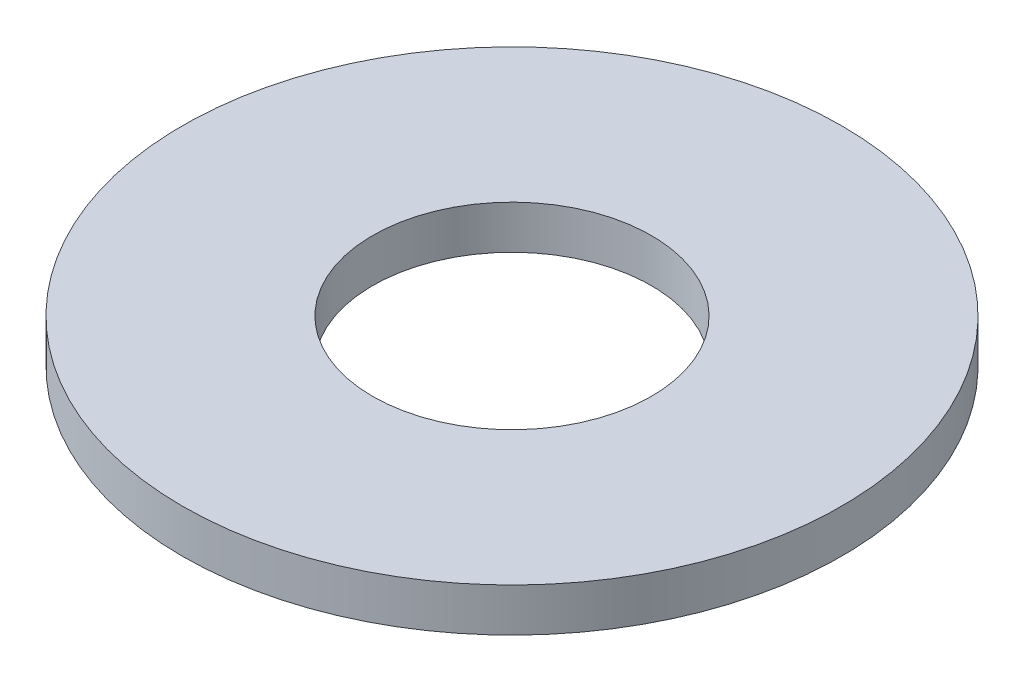
ISO-10303-21;
HEADER;
FILE_DESCRIPTION(('STEP AP214'),'2;1');
FILE_NAME('part.step','',(''),(''),'','','');
FILE_SCHEMA(('AUTOMOTIVE_DESIGN { 1 0 10303 214 1 1 1 1 }'));
ENDSEC;
DATA;
#1=APPLICATION_CONTEXT('core data for automotive mechanical design processes');
#2=APPLICATION_PROTOCOL_DEFINITION('international standard','automotive_design',2000,#1);
#3=PRODUCT_CONTEXT('',#1,'mechanical');
#4=PRODUCT('Part','Part','',(#3));
#5=PRODUCT_RELATED_PRODUCT_CATEGORY('part','',(#4));
#6=PRODUCT_DEFINITION_FORMATION('','',#4);
#7=PRODUCT_DEFINITION_CONTEXT('part definition',#1,'design');
#8=PRODUCT_DEFINITION('design','',#6,#7);
#9=PRODUCT_DEFINITION_SHAPE('','',#8);
#10=(LENGTH_UNIT() NAMED_UNIT(*) SI_UNIT(.MILLI.,.METRE.));
#11=(NAMED_UNIT(*) PLANE_ANGLE_UNIT() SI_UNIT($,.RADIAN.));
#12=(NAMED_UNIT(*) SI_UNIT($,.STERADIAN.) SOLID_ANGLE_UNIT());
#13=UNCERTAINTY_MEASURE_WITH_UNIT(LENGTH_MEASURE(1.E-05),#10,'distance_accuracy_value','');
#14=(GEOMETRIC_REPRESENTATION_CONTEXT(3) GLOBAL_UNCERTAINTY_ASSIGNED_CONTEXT((#13)) GLOBAL_UNIT_ASSIGNED_CONTEXT((#10,
#11,#12)) REPRESENTATION_CONTEXT('',''));
#15=CARTESIAN_POINT('',(0.,0.,0.));
#16=DIRECTION('',(0.,0.,1.));
#17=DIRECTION('',(1.,0.,0.));
#18=AXIS2_PLACEMENT_3D('',#15,#16,#17);
#19=CARTESIAN_POINT('',(0.,5.,0.));
#20=DIRECTION('',(0.,1.,0.));
#21=DIRECTION('',(0.,0.,1.));
#22=AXIS2_PLACEMENT_3D('',#19,#20,#21);
#23=PLANE('',#22);
#24=CARTESIAN_POINT('',(0.,5.,0.));
#25=DIRECTION('',(0.,1.,0.));
#26=DIRECTION('',(0.,0.,1.));
#27=AXIS2_PLACEMENT_3D('',#24,#25,#26);
#28=CIRCLE('',#27,37.95);
#29=CARTESIAN_POINT('',(0.,5.,37.95));
#30=VERTEX_POINT('',#29);
#31=EDGE_CURVE('E10',#30,#30,#28,.T.);
#32=ORIENTED_EDGE('',*,*,#31,.T.);
#33=EDGE_LOOP('',(#32));
#34=FACE_BOUND('',#33,.T.);
#35=CARTESIAN_POINT('',(0.,5.,0.));
#36=DIRECTION('',(0.,1.,0.));
#37=DIRECTION('',(0.,0.,1.));
#38=AXIS2_PLACEMENT_3D('',#35,#36,#37);
#39=CIRCLE('',#38,16.05);
#40=CARTESIAN_POINT('',(0.,5.,16.05));
#41=VERTEX_POINT('',#40);
#42=EDGE_CURVE('E52',#41,#41,#39,.T.);
#43=ORIENTED_EDGE('',*,*,#42,.F.);
#44=EDGE_LOOP('',(#43));
#45=FACE_BOUND('',#44,.T.);
#46=ADVANCED_FACE('F39',(#34,#45),#23,.T.);
#47=CARTESIAN_POINT('',(0.,0.,0.));
#48=DIRECTION('',(0.,1.,0.));
#49=DIRECTION('',(0.,0.,1.));
#50=AXIS2_PLACEMENT_3D('',#47,#48,#49);
#51=PLANE('',#50);
#52=CARTESIAN_POINT('',(0.,0.,0.));
#53=DIRECTION('',(0.,1.,0.));
#54=DIRECTION('',(0.,0.,1.));
#55=AXIS2_PLACEMENT_3D('',#52,#53,#54);
#56=CIRCLE('',#55,37.95);
#57=CARTESIAN_POINT('',(0.,0.,37.95));
#58=VERTEX_POINT('',#57);
#59=EDGE_CURVE('E43',#58,#58,#56,.T.);
#60=ORIENTED_EDGE('',*,*,#59,.F.);
#61=EDGE_LOOP('',(#60));
#62=FACE_BOUND('',#61,.T.);
#63=CARTESIAN_POINT('',(0.,0.,0.));
#64=DIRECTION('',(0.,1.,0.));
#65=DIRECTION('',(0.,0.,1.));
#66=AXIS2_PLACEMENT_3D('',#63,#64,#65);
#67=CIRCLE('',#66,16.05);
#68=CARTESIAN_POINT('',(0.,0.,16.05));
#69=VERTEX_POINT('',#68);
#70=EDGE_CURVE('E54',#69,#69,#67,.T.);
#71=ORIENTED_EDGE('',*,*,#70,.T.);
#72=EDGE_LOOP('',(#71));
#73=FACE_BOUND('',#72,.T.);
#74=ADVANCED_FACE('F66',(#62,#73),#51,.F.);
#75=CARTESIAN_POINT('',(0.,5.,0.));
#76=DIRECTION('',(0.,-1.,0.));
#77=DIRECTION('',(0.,0.,-1.));
#78=AXIS2_PLACEMENT_3D('',#75,#76,#77);
#79=CYLINDRICAL_SURFACE('',#78,37.95);
#80=ORIENTED_EDGE('',*,*,#31,.F.);
#81=EDGE_LOOP('',(#80));
#82=FACE_BOUND('',#81,.T.);
#83=ORIENTED_EDGE('',*,*,#59,.T.);
#84=EDGE_LOOP('',(#83));
#85=FACE_BOUND('',#84,.T.);
#86=ADVANCED_FACE('F41',(#82,#85),#79,.T.);
#87=CARTESIAN_POINT('',(0.,5.,0.));
#88=DIRECTION('',(0.,-1.,0.));
#89=DIRECTION('',(0.,0.,-1.));
#90=AXIS2_PLACEMENT_3D('',#87,#88,#89);
#91=CYLINDRICAL_SURFACE('',#90,16.05);
#92=ORIENTED_EDGE('',*,*,#42,.T.);
#93=EDGE_LOOP('',(#92));
#94=FACE_BOUND('',#93,.T.);
#95=ORIENTED_EDGE('',*,*,#70,.F.);
#96=EDGE_LOOP('',(#95));
#97=FACE_BOUND('',#96,.T.);
#98=ADVANCED_FACE('F62',(#94,#97),#91,.F.);
#99=CLOSED_SHELL('',(#46,#74,#86,#98));
#100=MANIFOLD_SOLID_BREP('B2',#99);
#101=ADVANCED_BREP_SHAPE_REPRESENTATION('',(#18,#100),#14);
#102=SHAPE_DEFINITION_REPRESENTATION(#9,#101);
ENDSEC;
END-ISO-10303-21;
